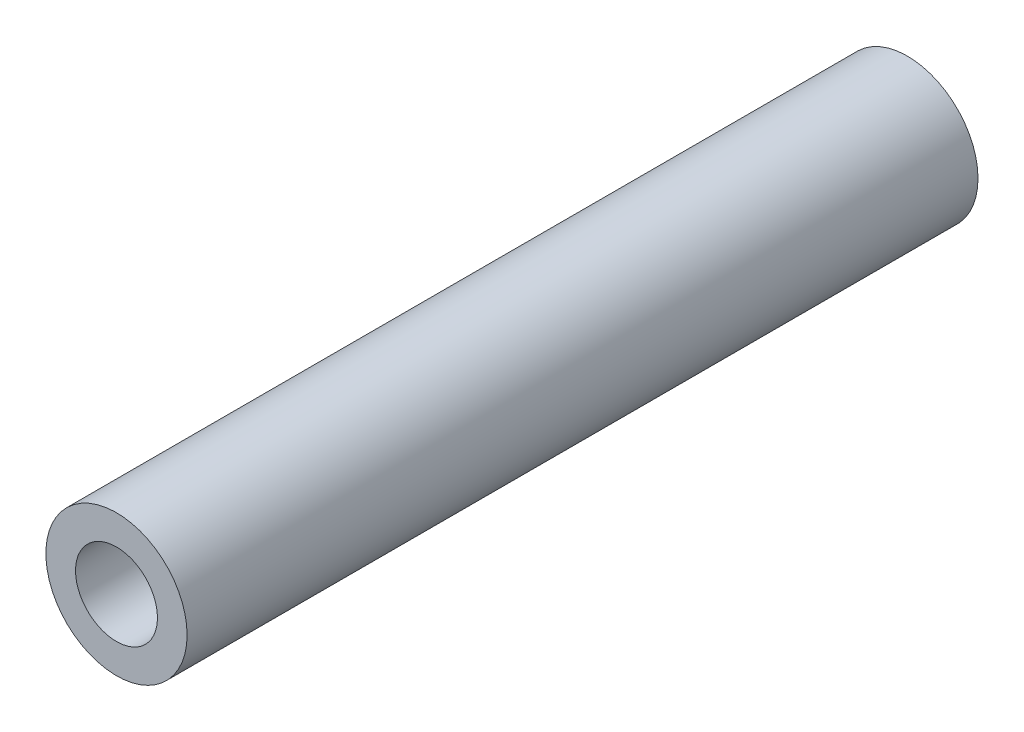
ISO-10303-21;
HEADER;
FILE_DESCRIPTION(('STEP AP214'),'2;1');
FILE_NAME('part.step','',(''),(''),'','','');
FILE_SCHEMA(('AUTOMOTIVE_DESIGN { 1 0 10303 214 1 1 1 1 }'));
ENDSEC;
DATA;
#1=APPLICATION_CONTEXT('core data for automotive mechanical design processes');
#2=APPLICATION_PROTOCOL_DEFINITION('international standard','automotive_design',2000,#1);
#3=PRODUCT_CONTEXT('',#1,'mechanical');
#4=PRODUCT('Part','Part','',(#3));
#5=PRODUCT_RELATED_PRODUCT_CATEGORY('part','',(#4));
#6=PRODUCT_DEFINITION_FORMATION('','',#4);
#7=PRODUCT_DEFINITION_CONTEXT('part definition',#1,'design');
#8=PRODUCT_DEFINITION('design','',#6,#7);
#9=PRODUCT_DEFINITION_SHAPE('','',#8);
#10=(LENGTH_UNIT() NAMED_UNIT(*) SI_UNIT(.MILLI.,.METRE.));
#11=(NAMED_UNIT(*) PLANE_ANGLE_UNIT() SI_UNIT($,.RADIAN.));
#12=(NAMED_UNIT(*) SI_UNIT($,.STERADIAN.) SOLID_ANGLE_UNIT());
#13=UNCERTAINTY_MEASURE_WITH_UNIT(LENGTH_MEASURE(1.E-05),#10,'distance_accuracy_value','');
#14=(GEOMETRIC_REPRESENTATION_CONTEXT(3) GLOBAL_UNCERTAINTY_ASSIGNED_CONTEXT((#13)) GLOBAL_UNIT_ASSIGNED_CONTEXT((#10,
#11,#12)) REPRESENTATION_CONTEXT('',''));
#15=CARTESIAN_POINT('',(0.,0.,0.));
#16=DIRECTION('',(0.,0.,1.));
#17=DIRECTION('',(1.,0.,0.));
#18=AXIS2_PLACEMENT_3D('',#15,#16,#17);
#19=CARTESIAN_POINT('',(0.,0.,56.));
#20=DIRECTION('',(0.,0.,-1.));
#21=DIRECTION('',(-1.,0.,0.));
#22=AXIS2_PLACEMENT_3D('',#19,#20,#21);
#23=CYLINDRICAL_SURFACE('',#22,5.);
#24=CARTESIAN_POINT('',(0.,0.,56.));
#25=DIRECTION('',(0.,0.,1.));
#26=DIRECTION('',(1.,0.,0.));
#27=AXIS2_PLACEMENT_3D('',#24,#25,#26);
#28=CIRCLE('',#27,5.);
#29=CARTESIAN_POINT('',(5.,0.,56.));
#30=VERTEX_POINT('',#29);
#31=EDGE_CURVE('E10',#30,#30,#28,.T.);
#32=ORIENTED_EDGE('',*,*,#31,.F.);
#33=EDGE_LOOP('',(#32));
#34=FACE_BOUND('',#33,.T.);
#35=CARTESIAN_POINT('',(0.,0.,0.));
#36=DIRECTION('',(0.,0.,1.));
#37=DIRECTION('',(1.,0.,0.));
#38=AXIS2_PLACEMENT_3D('',#35,#36,#37);
#39=CIRCLE('',#38,5.);
#40=CARTESIAN_POINT('',(5.,0.,0.));
#41=VERTEX_POINT('',#40);
#42=EDGE_CURVE('E40',#41,#41,#39,.T.);
#43=ORIENTED_EDGE('',*,*,#42,.T.);
#44=EDGE_LOOP('',(#43));
#45=FACE_BOUND('',#44,.T.);
#46=ADVANCED_FACE('F37',(#34,#45),#23,.T.);
#47=CARTESIAN_POINT('',(0.,0.,56.));
#48=DIRECTION('',(0.,0.,1.));
#49=DIRECTION('',(1.,0.,0.));
#50=AXIS2_PLACEMENT_3D('',#47,#48,#49);
#51=PLANE('',#50);
#52=CARTESIAN_POINT('',(0.,0.,56.));
#53=DIRECTION('',(0.,0.,-1.));
#54=DIRECTION('',(-1.,0.,0.));
#55=AXIS2_PLACEMENT_3D('',#52,#53,#54);
#56=CIRCLE('',#55,2.89999999999999);
#57=CARTESIAN_POINT('',(-2.89999999999999,0.,56.));
#58=VERTEX_POINT('',#57);
#59=EDGE_CURVE('E49',#58,#58,#56,.T.);
#60=ORIENTED_EDGE('',*,*,#59,.T.);
#61=EDGE_LOOP('',(#60));
#62=FACE_BOUND('',#61,.T.);
#63=ORIENTED_EDGE('',*,*,#31,.T.);
#64=EDGE_LOOP('',(#63));
#65=FACE_BOUND('',#64,.T.);
#66=ADVANCED_FACE('F64',(#62,#65),#51,.T.);
#67=CARTESIAN_POINT('',(0.,0.,0.));
#68=DIRECTION('',(0.,0.,1.));
#69=DIRECTION('',(1.,0.,0.));
#70=AXIS2_PLACEMENT_3D('',#67,#68,#69);
#71=PLANE('',#70);
#72=CARTESIAN_POINT('',(0.,0.,0.));
#73=DIRECTION('',(0.,0.,-1.));
#74=DIRECTION('',(-1.,0.,0.));
#75=AXIS2_PLACEMENT_3D('',#72,#73,#74);
#76=CIRCLE('',#75,2.9);
#77=CARTESIAN_POINT('',(-2.9,0.,0.));
#78=VERTEX_POINT('',#77);
#79=EDGE_CURVE('E54',#78,#78,#76,.T.);
#80=ORIENTED_EDGE('',*,*,#79,.F.);
#81=EDGE_LOOP('',(#80));
#82=FACE_BOUND('',#81,.T.);
#83=ORIENTED_EDGE('',*,*,#42,.F.);
#84=EDGE_LOOP('',(#83));
#85=FACE_BOUND('',#84,.T.);
#86=ADVANCED_FACE('F61',(#82,#85),#71,.F.);
#87=CARTESIAN_POINT('',(0.,0.,0.));
#88=DIRECTION('',(0.,0.,-1.));
#89=DIRECTION('',(-1.,0.,0.));
#90=AXIS2_PLACEMENT_3D('',#87,#88,#89);
#91=CYLINDRICAL_SURFACE('',#90,2.89999999999999);
#92=ORIENTED_EDGE('',*,*,#59,.F.);
#93=EDGE_LOOP('',(#92));
#94=FACE_BOUND('',#93,.T.);
#95=ORIENTED_EDGE('',*,*,#79,.T.);
#96=EDGE_LOOP('',(#95));
#97=FACE_BOUND('',#96,.T.);
#98=ADVANCED_FACE('F59',(#94,#97),#91,.F.);
#99=CLOSED_SHELL('',(#46,#66,#86,#98));
#100=MANIFOLD_SOLID_BREP('B2',#99);
#101=ADVANCED_BREP_SHAPE_REPRESENTATION('',(#18,#100),#14);
#102=SHAPE_DEFINITION_REPRESENTATION(#9,#101);
ENDSEC;
END-ISO-10303-21;
